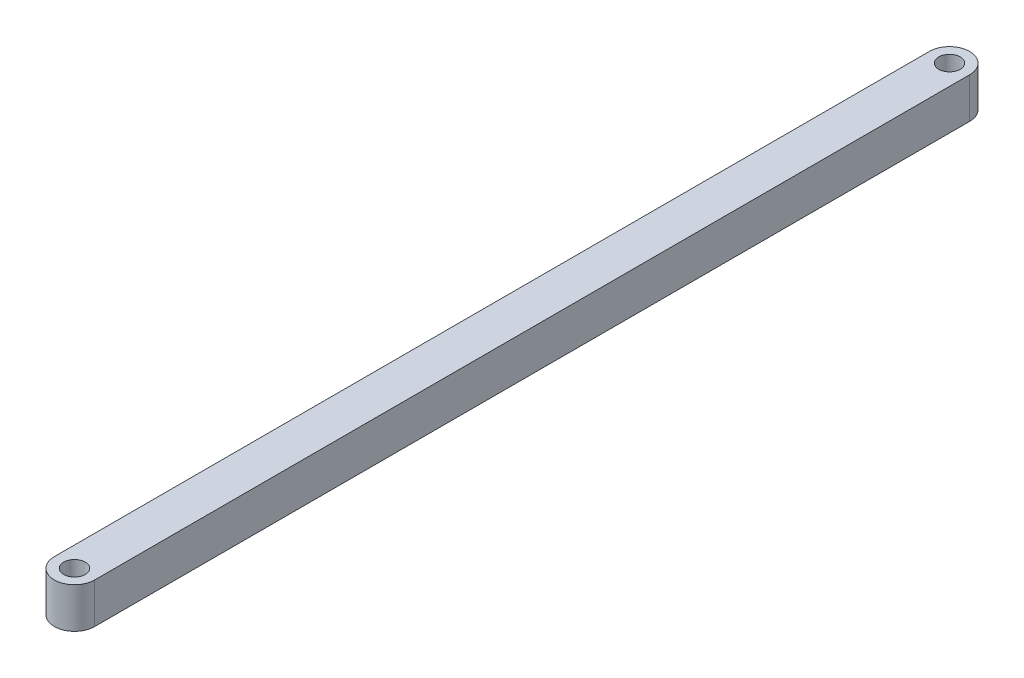
ISO-10303-21;
HEADER;
FILE_DESCRIPTION(('STEP AP214'),'2;1');
FILE_NAME('part.step','',(''),(''),'','','');
FILE_SCHEMA(('AUTOMOTIVE_DESIGN { 1 0 10303 214 1 1 1 1 }'));
ENDSEC;
DATA;
#1=APPLICATION_CONTEXT('core data for automotive mechanical design processes');
#2=APPLICATION_PROTOCOL_DEFINITION('international standard','automotive_design',2000,#1);
#3=PRODUCT_CONTEXT('',#1,'mechanical');
#4=PRODUCT('Part','Part','',(#3));
#5=PRODUCT_RELATED_PRODUCT_CATEGORY('part','',(#4));
#6=PRODUCT_DEFINITION_FORMATION('','',#4);
#7=PRODUCT_DEFINITION_CONTEXT('part definition',#1,'design');
#8=PRODUCT_DEFINITION('design','',#6,#7);
#9=PRODUCT_DEFINITION_SHAPE('','',#8);
#10=(LENGTH_UNIT() NAMED_UNIT(*) SI_UNIT(.MILLI.,.METRE.));
#11=(NAMED_UNIT(*) PLANE_ANGLE_UNIT() SI_UNIT($,.RADIAN.));
#12=(NAMED_UNIT(*) SI_UNIT($,.STERADIAN.) SOLID_ANGLE_UNIT());
#13=UNCERTAINTY_MEASURE_WITH_UNIT(LENGTH_MEASURE(1.E-05),#10,'distance_accuracy_value','');
#14=(GEOMETRIC_REPRESENTATION_CONTEXT(3) GLOBAL_UNCERTAINTY_ASSIGNED_CONTEXT((#13)) GLOBAL_UNIT_ASSIGNED_CONTEXT((#10,
#11,#12)) REPRESENTATION_CONTEXT('',''));
#15=CARTESIAN_POINT('',(0.,0.,0.));
#16=DIRECTION('',(0.,0.,1.));
#17=DIRECTION('',(1.,0.,0.));
#18=AXIS2_PLACEMENT_3D('',#15,#16,#17);
#19=CARTESIAN_POINT('',(0.,6.,64.996300345));
#20=DIRECTION('',(0.,1.,0.));
#21=DIRECTION('',(0.,0.,1.));
#22=AXIS2_PLACEMENT_3D('',#19,#20,#21);
#23=PLANE('',#22);
#24=CARTESIAN_POINT('',(0.,6.,-64.996300345));
#25=DIRECTION('',(0.,1.,0.));
#26=DIRECTION('',(0.,0.,1.));
#27=AXIS2_PLACEMENT_3D('',#24,#25,#26);
#28=CIRCLE('',#27,1.6);
#29=CARTESIAN_POINT('',(0.,6.,-63.396300345));
#30=VERTEX_POINT('',#29);
#31=EDGE_CURVE('E104',#30,#30,#28,.T.);
#32=ORIENTED_EDGE('',*,*,#31,.F.);
#33=EDGE_LOOP('',(#32));
#34=FACE_BOUND('',#33,.T.);
#35=CARTESIAN_POINT('',(0.,6.,64.996300345));
#36=DIRECTION('',(0.,1.,0.));
#37=DIRECTION('',(0.,0.,1.));
#38=AXIS2_PLACEMENT_3D('',#35,#36,#37);
#39=CIRCLE('',#38,3.);
#40=CARTESIAN_POINT('',(-3.,6.,64.996300345));
#41=VERTEX_POINT('',#40);
#42=CARTESIAN_POINT('',(3.,6.,64.996300345));
#43=VERTEX_POINT('',#42);
#44=EDGE_CURVE('E89',#41,#43,#39,.T.);
#45=ORIENTED_EDGE('',*,*,#44,.T.);
#46=DIRECTION('',(0.,0.,-1.));
#47=VECTOR('',#46,1.);
#48=CARTESIAN_POINT('',(3.,6.,64.996300345));
#49=LINE('',#48,#47);
#50=CARTESIAN_POINT('',(2.99999999999998,6.,-64.996300345));
#51=VERTEX_POINT('',#50);
#52=EDGE_CURVE('E84',#43,#51,#49,.T.);
#53=ORIENTED_EDGE('',*,*,#52,.T.);
#54=CARTESIAN_POINT('',(0.,6.,-64.996300345));
#55=DIRECTION('',(0.,1.,0.));
#56=DIRECTION('',(0.,0.,1.));
#57=AXIS2_PLACEMENT_3D('',#54,#55,#56);
#58=CIRCLE('',#57,3.);
#59=CARTESIAN_POINT('',(-3.00000000000003,6.,-64.996300345));
#60=VERTEX_POINT('',#59);
#61=EDGE_CURVE('E87',#51,#60,#58,.T.);
#62=ORIENTED_EDGE('',*,*,#61,.T.);
#63=DIRECTION('',(0.,0.,1.));
#64=VECTOR('',#63,1.);
#65=CARTESIAN_POINT('',(-3.,6.,64.996300345));
#66=LINE('',#65,#64);
#67=EDGE_CURVE('E54',#60,#41,#66,.T.);
#68=ORIENTED_EDGE('',*,*,#67,.T.);
#69=EDGE_LOOP('',(#45,#53,#62,#68));
#70=FACE_BOUND('',#69,.T.);
#71=CARTESIAN_POINT('',(0.,6.,64.996300345));
#72=DIRECTION('',(0.,1.,0.));
#73=DIRECTION('',(0.,0.,1.));
#74=AXIS2_PLACEMENT_3D('',#71,#72,#73);
#75=CIRCLE('',#74,1.6);
#76=CARTESIAN_POINT('',(0.,6.,66.596300345));
#77=VERTEX_POINT('',#76);
#78=EDGE_CURVE('E119',#77,#77,#75,.T.);
#79=ORIENTED_EDGE('',*,*,#78,.F.);
#80=EDGE_LOOP('',(#79));
#81=FACE_BOUND('',#80,.T.);
#82=ADVANCED_FACE('F37',(#34,#70,#81),#23,.T.);
#83=CARTESIAN_POINT('',(0.,0.,64.996300345));
#84=DIRECTION('',(0.,1.,0.));
#85=DIRECTION('',(0.,0.,1.));
#86=AXIS2_PLACEMENT_3D('',#83,#84,#85);
#87=PLANE('',#86);
#88=CARTESIAN_POINT('',(0.,0.,64.996300345));
#89=DIRECTION('',(0.,1.,0.));
#90=DIRECTION('',(0.,0.,1.));
#91=AXIS2_PLACEMENT_3D('',#88,#89,#90);
#92=CIRCLE('',#91,3.);
#93=CARTESIAN_POINT('',(-3.,0.,64.996300345));
#94=VERTEX_POINT('',#93);
#95=CARTESIAN_POINT('',(3.,0.,64.996300345));
#96=VERTEX_POINT('',#95);
#97=EDGE_CURVE('E101',#94,#96,#92,.T.);
#98=ORIENTED_EDGE('',*,*,#97,.F.);
#99=DIRECTION('',(0.,0.,1.));
#100=VECTOR('',#99,1.);
#101=CARTESIAN_POINT('',(-3.,0.,64.996300345));
#102=LINE('',#101,#100);
#103=CARTESIAN_POINT('',(-3.00000000000003,0.,-64.996300345));
#104=VERTEX_POINT('',#103);
#105=EDGE_CURVE('E77',#104,#94,#102,.T.);
#106=ORIENTED_EDGE('',*,*,#105,.F.);
#107=CARTESIAN_POINT('',(0.,0.,-64.996300345));
#108=DIRECTION('',(0.,1.,0.));
#109=DIRECTION('',(0.,0.,1.));
#110=AXIS2_PLACEMENT_3D('',#107,#108,#109);
#111=CIRCLE('',#110,3.);
#112=CARTESIAN_POINT('',(2.99999999999998,0.,-64.996300345));
#113=VERTEX_POINT('',#112);
#114=EDGE_CURVE('E71',#113,#104,#111,.T.);
#115=ORIENTED_EDGE('',*,*,#114,.F.);
#116=DIRECTION('',(0.,0.,-1.));
#117=VECTOR('',#116,1.);
#118=CARTESIAN_POINT('',(3.,0.,64.996300345));
#119=LINE('',#118,#117);
#120=EDGE_CURVE('E93',#96,#113,#119,.T.);
#121=ORIENTED_EDGE('',*,*,#120,.F.);
#122=EDGE_LOOP('',(#98,#106,#115,#121));
#123=FACE_BOUND('',#122,.T.);
#124=CARTESIAN_POINT('',(0.,0.,-64.996300345));
#125=DIRECTION('',(0.,1.,0.));
#126=DIRECTION('',(0.,0.,1.));
#127=AXIS2_PLACEMENT_3D('',#124,#125,#126);
#128=CIRCLE('',#127,1.6);
#129=CARTESIAN_POINT('',(0.,0.,-63.396300345));
#130=VERTEX_POINT('',#129);
#131=EDGE_CURVE('E116',#130,#130,#128,.T.);
#132=ORIENTED_EDGE('',*,*,#131,.T.);
#133=EDGE_LOOP('',(#132));
#134=FACE_BOUND('',#133,.T.);
#135=CARTESIAN_POINT('',(0.,0.,64.996300345));
#136=DIRECTION('',(0.,1.,0.));
#137=DIRECTION('',(0.,0.,1.));
#138=AXIS2_PLACEMENT_3D('',#135,#136,#137);
#139=CIRCLE('',#138,1.6);
#140=CARTESIAN_POINT('',(0.,0.,66.596300345));
#141=VERTEX_POINT('',#140);
#142=EDGE_CURVE('E122',#141,#141,#139,.T.);
#143=ORIENTED_EDGE('',*,*,#142,.T.);
#144=EDGE_LOOP('',(#143));
#145=FACE_BOUND('',#144,.T.);
#146=ADVANCED_FACE('F112',(#123,#134,#145),#87,.F.);
#147=CARTESIAN_POINT('',(0.,6.,64.996300345));
#148=DIRECTION('',(0.,-1.,0.));
#149=DIRECTION('',(0.,0.,-1.));
#150=AXIS2_PLACEMENT_3D('',#147,#148,#149);
#151=CYLINDRICAL_SURFACE('',#150,3.);
#152=ORIENTED_EDGE('',*,*,#97,.T.);
#153=DIRECTION('',(0.,-1.,0.));
#154=VECTOR('',#153,1.);
#155=CARTESIAN_POINT('',(3.,6.,64.996300345));
#156=LINE('',#155,#154);
#157=EDGE_CURVE('E11',#43,#96,#156,.T.);
#158=ORIENTED_EDGE('',*,*,#157,.F.);
#159=ORIENTED_EDGE('',*,*,#44,.F.);
#160=DIRECTION('',(0.,-1.,0.));
#161=VECTOR('',#160,1.);
#162=CARTESIAN_POINT('',(-3.,6.,64.996300345));
#163=LINE('',#162,#161);
#164=EDGE_CURVE('E97',#41,#94,#163,.T.);
#165=ORIENTED_EDGE('',*,*,#164,.T.);
#166=EDGE_LOOP('',(#152,#158,#159,#165));
#167=FACE_BOUND('',#166,.T.);
#168=ADVANCED_FACE('F39',(#167),#151,.T.);
#169=CARTESIAN_POINT('',(3.,6.,64.996300345));
#170=DIRECTION('',(-1.,0.,0.));
#171=DIRECTION('',(0.,0.,1.));
#172=AXIS2_PLACEMENT_3D('',#169,#170,#171);
#173=PLANE('',#172);
#174=ORIENTED_EDGE('',*,*,#120,.T.);
#175=DIRECTION('',(0.,-1.,0.));
#176=VECTOR('',#175,1.);
#177=CARTESIAN_POINT('',(2.99999999999998,6.,-64.996300345));
#178=LINE('',#177,#176);
#179=EDGE_CURVE('E46',#51,#113,#178,.T.);
#180=ORIENTED_EDGE('',*,*,#179,.F.);
#181=ORIENTED_EDGE('',*,*,#52,.F.);
#182=ORIENTED_EDGE('',*,*,#157,.T.);
#183=EDGE_LOOP('',(#174,#180,#181,#182));
#184=FACE_BOUND('',#183,.T.);
#185=ADVANCED_FACE('F92',(#184),#173,.F.);
#186=CARTESIAN_POINT('',(0.,6.,-64.996300345));
#187=DIRECTION('',(0.,-1.,0.));
#188=DIRECTION('',(0.,0.,-1.));
#189=AXIS2_PLACEMENT_3D('',#186,#187,#188);
#190=CYLINDRICAL_SURFACE('',#189,3.);
#191=ORIENTED_EDGE('',*,*,#114,.T.);
#192=DIRECTION('',(0.,-1.,0.));
#193=VECTOR('',#192,1.);
#194=CARTESIAN_POINT('',(-3.00000000000003,6.,-64.996300345));
#195=LINE('',#194,#193);
#196=EDGE_CURVE('E94',#60,#104,#195,.T.);
#197=ORIENTED_EDGE('',*,*,#196,.F.);
#198=ORIENTED_EDGE('',*,*,#61,.F.);
#199=ORIENTED_EDGE('',*,*,#179,.T.);
#200=EDGE_LOOP('',(#191,#197,#198,#199));
#201=FACE_BOUND('',#200,.T.);
#202=ADVANCED_FACE('F95',(#201),#190,.T.);
#203=CARTESIAN_POINT('',(-3.,6.,64.996300345));
#204=DIRECTION('',(1.,0.,0.));
#205=DIRECTION('',(0.,0.,-1.));
#206=AXIS2_PLACEMENT_3D('',#203,#204,#205);
#207=PLANE('',#206);
#208=ORIENTED_EDGE('',*,*,#105,.T.);
#209=ORIENTED_EDGE('',*,*,#164,.F.);
#210=ORIENTED_EDGE('',*,*,#67,.F.);
#211=ORIENTED_EDGE('',*,*,#196,.T.);
#212=EDGE_LOOP('',(#208,#209,#210,#211));
#213=FACE_BOUND('',#212,.T.);
#214=ADVANCED_FACE('F109',(#213),#207,.F.);
#215=CARTESIAN_POINT('',(0.,6.,-64.996300345));
#216=DIRECTION('',(0.,-1.,0.));
#217=DIRECTION('',(0.,0.,-1.));
#218=AXIS2_PLACEMENT_3D('',#215,#216,#217);
#219=CYLINDRICAL_SURFACE('',#218,1.6);
#220=ORIENTED_EDGE('',*,*,#31,.T.);
#221=EDGE_LOOP('',(#220));
#222=FACE_BOUND('',#221,.T.);
#223=ORIENTED_EDGE('',*,*,#131,.F.);
#224=EDGE_LOOP('',(#223));
#225=FACE_BOUND('',#224,.T.);
#226=ADVANCED_FACE('F139',(#222,#225),#219,.F.);
#227=CARTESIAN_POINT('',(0.,6.,64.996300345));
#228=DIRECTION('',(0.,-1.,0.));
#229=DIRECTION('',(0.,0.,-1.));
#230=AXIS2_PLACEMENT_3D('',#227,#228,#229);
#231=CYLINDRICAL_SURFACE('',#230,1.6);
#232=ORIENTED_EDGE('',*,*,#78,.T.);
#233=EDGE_LOOP('',(#232));
#234=FACE_BOUND('',#233,.T.);
#235=ORIENTED_EDGE('',*,*,#142,.F.);
#236=EDGE_LOOP('',(#235));
#237=FACE_BOUND('',#236,.T.);
#238=ADVANCED_FACE('F128',(#234,#237),#231,.F.);
#239=CLOSED_SHELL('',(#82,#146,#168,#185,#202,#214,#226,#238));
#240=MANIFOLD_SOLID_BREP('B2',#239);
#241=ADVANCED_BREP_SHAPE_REPRESENTATION('',(#18,#240),#14);
#242=SHAPE_DEFINITION_REPRESENTATION(#9,#241);
ENDSEC;
END-ISO-10303-21;
